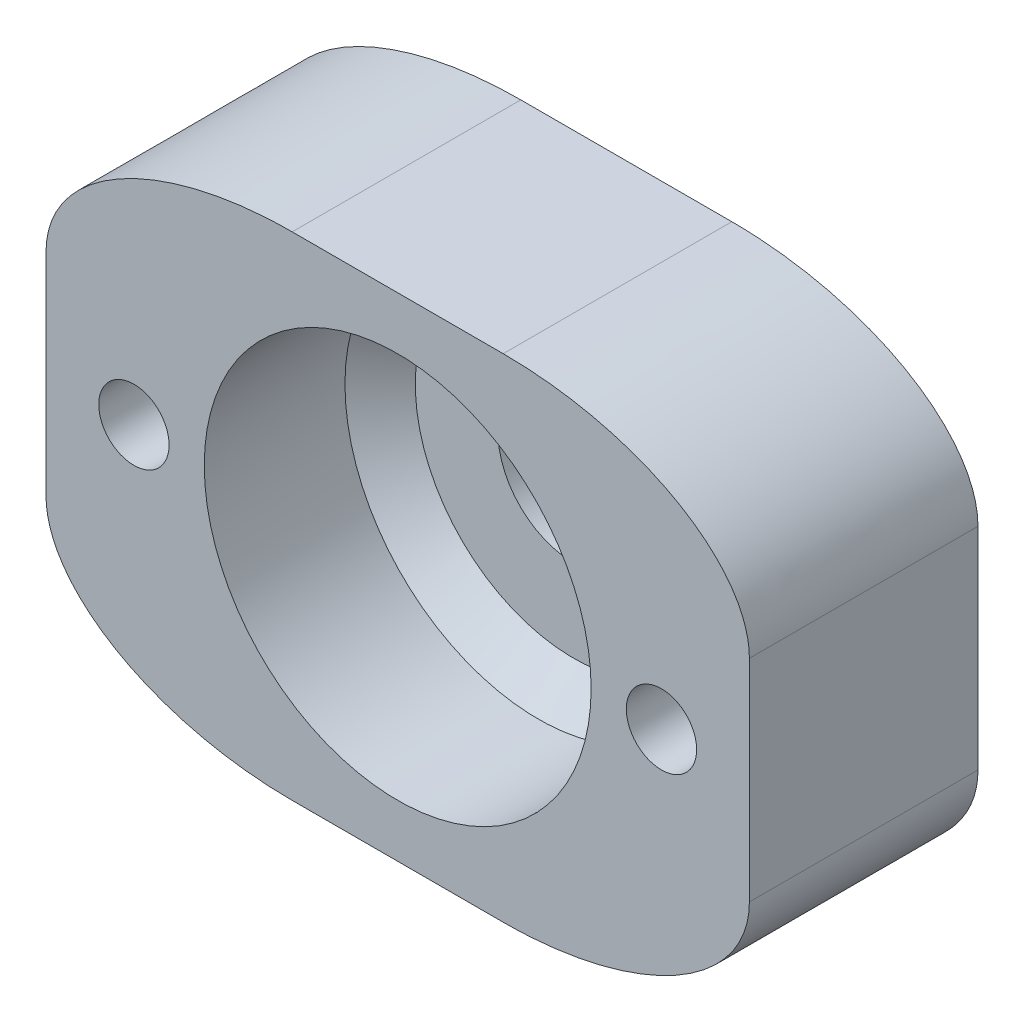
ISO-10303-21;
HEADER;
FILE_DESCRIPTION(('STEP AP214'),'2;1');
FILE_NAME('part.step','',(''),(''),'','','');
FILE_SCHEMA(('AUTOMOTIVE_DESIGN { 1 0 10303 214 1 1 1 1 }'));
ENDSEC;
DATA;
#1=APPLICATION_CONTEXT('core data for automotive mechanical design processes');
#2=APPLICATION_PROTOCOL_DEFINITION('international standard','automotive_design',2000,#1);
#3=PRODUCT_CONTEXT('',#1,'mechanical');
#4=PRODUCT('Part','Part','',(#3));
#5=PRODUCT_RELATED_PRODUCT_CATEGORY('part','',(#4));
#6=PRODUCT_DEFINITION_FORMATION('','',#4);
#7=PRODUCT_DEFINITION_CONTEXT('part definition',#1,'design');
#8=PRODUCT_DEFINITION('design','',#6,#7);
#9=PRODUCT_DEFINITION_SHAPE('','',#8);
#10=(LENGTH_UNIT() NAMED_UNIT(*) SI_UNIT(.MILLI.,.METRE.));
#11=(NAMED_UNIT(*) PLANE_ANGLE_UNIT() SI_UNIT($,.RADIAN.));
#12=(NAMED_UNIT(*) SI_UNIT($,.STERADIAN.) SOLID_ANGLE_UNIT());
#13=UNCERTAINTY_MEASURE_WITH_UNIT(LENGTH_MEASURE(1.E-05),#10,'distance_accuracy_value','');
#14=(GEOMETRIC_REPRESENTATION_CONTEXT(3) GLOBAL_UNCERTAINTY_ASSIGNED_CONTEXT((#13)) GLOBAL_UNIT_ASSIGNED_CONTEXT((#10,
#11,#12)) REPRESENTATION_CONTEXT('',''));
#15=CARTESIAN_POINT('',(0.,0.,0.));
#16=DIRECTION('',(0.,0.,1.));
#17=DIRECTION('',(1.,0.,0.));
#18=AXIS2_PLACEMENT_3D('',#15,#16,#17);
#19=CARTESIAN_POINT('',(0.,0.,10.));
#20=DIRECTION('',(0.,0.,-1.));
#21=DIRECTION('',(-1.,0.,0.));
#22=AXIS2_PLACEMENT_3D('',#19,#20,#21);
#23=PLANE('',#22);
#24=CARTESIAN_POINT('',(-15.,0.,10.));
#25=DIRECTION('',(0.,0.,1.));
#26=DIRECTION('',(1.,0.,0.));
#27=AXIS2_PLACEMENT_3D('',#24,#25,#26);
#28=CIRCLE('',#27,2.);
#29=CARTESIAN_POINT('',(-13.,0.,10.));
#30=VERTEX_POINT('',#29);
#31=EDGE_CURVE('E475',#30,#30,#28,.T.);
#32=ORIENTED_EDGE('',*,*,#31,.F.);
#33=EDGE_LOOP('',(#32));
#34=FACE_BOUND('',#33,.T.);
#35=CARTESIAN_POINT('',(15.,0.,10.));
#36=DIRECTION('',(0.,0.,1.));
#37=DIRECTION('',(1.,0.,0.));
#38=AXIS2_PLACEMENT_3D('',#35,#36,#37);
#39=CIRCLE('',#38,2.);
#40=CARTESIAN_POINT('',(17.,0.,10.));
#41=VERTEX_POINT('',#40);
#42=EDGE_CURVE('E481',#41,#41,#39,.T.);
#43=ORIENTED_EDGE('',*,*,#42,.F.);
#44=EDGE_LOOP('',(#43));
#45=FACE_BOUND('',#44,.T.);
#46=DIRECTION('',(0.,1.,0.));
#47=VECTOR('',#46,1.);
#48=CARTESIAN_POINT('',(20.,-14.,10.));
#49=LINE('',#48,#47);
#50=CARTESIAN_POINT('',(20.,-6.,10.));
#51=VERTEX_POINT('',#50);
#52=CARTESIAN_POINT('',(20.,6.,10.));
#53=VERTEX_POINT('',#52);
#54=EDGE_CURVE('E153',#51,#53,#49,.T.);
#55=ORIENTED_EDGE('',*,*,#54,.T.);
#56=CARTESIAN_POINT('',(6.00000000000001,14.,10.));
#57=CARTESIAN_POINT('',(20.,14.,10.));
#58=CARTESIAN_POINT('',(20.,6.,10.));
#59=(BOUNDED_CURVE() B_SPLINE_CURVE(2,(#56,#57,#58),.UNSPECIFIED.,.F.,
.F.) B_SPLINE_CURVE_WITH_KNOTS((3,3),(0.,1.),
.UNSPECIFIED.) CURVE() GEOMETRIC_REPRESENTATION_ITEM() RATIONAL_B_SPLINE_CURVE((1.,
0.707106781186548,1.)) REPRESENTATION_ITEM(''));
#60=CARTESIAN_POINT('',(6.00000000000001,14.,10.));
#61=VERTEX_POINT('',#60);
#62=EDGE_CURVE('E261',#53,#61,#59,.F.);
#63=ORIENTED_EDGE('',*,*,#62,.T.);
#64=DIRECTION('',(-1.,0.,0.));
#65=VECTOR('',#64,1.);
#66=CARTESIAN_POINT('',(-20.,14.,10.));
#67=LINE('',#66,#65);
#68=CARTESIAN_POINT('',(-5.99999999999999,14.,10.));
#69=VERTEX_POINT('',#68);
#70=EDGE_CURVE('E320',#61,#69,#67,.T.);
#71=ORIENTED_EDGE('',*,*,#70,.T.);
#72=CARTESIAN_POINT('',(-20.,6.,10.));
#73=CARTESIAN_POINT('',(-20.,14.,10.));
#74=CARTESIAN_POINT('',(-5.99999999999999,14.,10.));
#75=(BOUNDED_CURVE() B_SPLINE_CURVE(2,(#72,#73,#74),.UNSPECIFIED.,.F.,
.F.) B_SPLINE_CURVE_WITH_KNOTS((3,3),(0.,1.),
.UNSPECIFIED.) CURVE() GEOMETRIC_REPRESENTATION_ITEM() RATIONAL_B_SPLINE_CURVE((1.,
0.707106781186548,1.)) REPRESENTATION_ITEM(''));
#76=CARTESIAN_POINT('',(-20.,6.,10.));
#77=VERTEX_POINT('',#76);
#78=EDGE_CURVE('E328',#69,#77,#75,.F.);
#79=ORIENTED_EDGE('',*,*,#78,.T.);
#80=DIRECTION('',(0.,-1.,0.));
#81=VECTOR('',#80,1.);
#82=CARTESIAN_POINT('',(-20.,-14.,10.));
#83=LINE('',#82,#81);
#84=CARTESIAN_POINT('',(-20.,-6.,10.));
#85=VERTEX_POINT('',#84);
#86=EDGE_CURVE('E195',#77,#85,#83,.T.);
#87=ORIENTED_EDGE('',*,*,#86,.T.);
#88=CARTESIAN_POINT('',(-5.99999999999999,-14.,10.));
#89=CARTESIAN_POINT('',(-20.,-14.,10.));
#90=CARTESIAN_POINT('',(-20.,-6.,10.));
#91=(BOUNDED_CURVE() B_SPLINE_CURVE(2,(#88,#89,#90),.UNSPECIFIED.,.F.,
.F.) B_SPLINE_CURVE_WITH_KNOTS((3,3),(0.,1.),
.UNSPECIFIED.) CURVE() GEOMETRIC_REPRESENTATION_ITEM() RATIONAL_B_SPLINE_CURVE((1.,
0.707106781186548,1.)) REPRESENTATION_ITEM(''));
#92=CARTESIAN_POINT('',(-5.99999999999999,-14.,10.));
#93=VERTEX_POINT('',#92);
#94=EDGE_CURVE('E74',#85,#93,#91,.F.);
#95=ORIENTED_EDGE('',*,*,#94,.T.);
#96=DIRECTION('',(1.,0.,0.));
#97=VECTOR('',#96,1.);
#98=CARTESIAN_POINT('',(-20.,-14.,10.));
#99=LINE('',#98,#97);
#100=CARTESIAN_POINT('',(6.00000000000001,-14.,10.));
#101=VERTEX_POINT('',#100);
#102=EDGE_CURVE('E187',#93,#101,#99,.T.);
#103=ORIENTED_EDGE('',*,*,#102,.T.);
#104=CARTESIAN_POINT('',(20.,-6.,10.));
#105=CARTESIAN_POINT('',(20.,-14.,10.));
#106=CARTESIAN_POINT('',(6.00000000000001,-14.,10.));
#107=(BOUNDED_CURVE() B_SPLINE_CURVE(2,(#104,#105,#106),.UNSPECIFIED.,.F.,
.F.) B_SPLINE_CURVE_WITH_KNOTS((3,3),(0.,1.),
.UNSPECIFIED.) CURVE() GEOMETRIC_REPRESENTATION_ITEM() RATIONAL_B_SPLINE_CURVE((1.,
0.707106781186548,1.)) REPRESENTATION_ITEM(''));
#108=EDGE_CURVE('E332',#101,#51,#107,.F.);
#109=ORIENTED_EDGE('',*,*,#108,.T.);
#110=EDGE_LOOP('',(#55,#63,#71,#79,#87,#95,#103,#109));
#111=FACE_BOUND('',#110,.T.);
#112=CARTESIAN_POINT('',(0.,0.,10.));
#113=DIRECTION('',(0.,0.,1.));
#114=DIRECTION('',(1.,0.,0.));
#115=AXIS2_PLACEMENT_3D('',#112,#113,#114);
#116=CIRCLE('',#115,11.);
#117=CARTESIAN_POINT('',(11.,0.,10.));
#118=VERTEX_POINT('',#117);
#119=EDGE_CURVE('E423',#118,#118,#116,.T.);
#120=ORIENTED_EDGE('',*,*,#119,.F.);
#121=EDGE_LOOP('',(#120));
#122=FACE_BOUND('',#121,.T.);
#123=ADVANCED_FACE('F47',(#34,#45,#111,#122),#23,.F.);
#124=CARTESIAN_POINT('',(20.,-14.,10.));
#125=DIRECTION('',(-1.,0.,0.));
#126=DIRECTION('',(0.,0.,1.));
#127=AXIS2_PLACEMENT_3D('',#124,#125,#126);
#128=PLANE('',#127);
#129=DIRECTION('',(0.,-1.,0.));
#130=VECTOR('',#129,1.);
#131=CARTESIAN_POINT('',(20.,-14.,-3.));
#132=LINE('',#131,#130);
#133=CARTESIAN_POINT('',(20.,6.,-3.));
#134=VERTEX_POINT('',#133);
#135=CARTESIAN_POINT('',(20.,-6.,-3.));
#136=VERTEX_POINT('',#135);
#137=EDGE_CURVE('E119',#134,#136,#132,.T.);
#138=ORIENTED_EDGE('',*,*,#137,.F.);
#139=CARTESIAN_POINT('',(20.,6.,10.65));
#140=CARTESIAN_POINT('',(20.,6.,5.88333333333334));
#141=CARTESIAN_POINT('',(20.,6.,1.11666666666666));
#142=CARTESIAN_POINT('',(20.,6.,-3.65));
#143=(BOUNDED_CURVE() B_SPLINE_CURVE(3,(#139,#140,#141,#142),.UNSPECIFIED.,.F.,
.F.) B_SPLINE_CURVE_WITH_KNOTS((4,4),(-0.00065,0.01365),
.UNSPECIFIED.) CURVE() GEOMETRIC_REPRESENTATION_ITEM() RATIONAL_B_SPLINE_CURVE((1.,1.,1.,1.)) REPRESENTATION_ITEM(''));
#144=EDGE_CURVE('E702',#134,#53,#143,.F.);
#145=ORIENTED_EDGE('',*,*,#144,.T.);
#146=ORIENTED_EDGE('',*,*,#54,.F.);
#147=CARTESIAN_POINT('',(20.,-6.,-3.65));
#148=CARTESIAN_POINT('',(20.,-6.,1.11666666666666));
#149=CARTESIAN_POINT('',(20.,-6.,5.88333333333334));
#150=CARTESIAN_POINT('',(20.,-6.,10.65));
#151=(BOUNDED_CURVE() B_SPLINE_CURVE(3,(#147,#148,#149,#150),.UNSPECIFIED.,.F.,
.F.) B_SPLINE_CURVE_WITH_KNOTS((4,4),(-0.00065,0.01365),
.UNSPECIFIED.) CURVE() GEOMETRIC_REPRESENTATION_ITEM() RATIONAL_B_SPLINE_CURVE((1.,1.,1.,1.)) REPRESENTATION_ITEM(''));
#152=EDGE_CURVE('E141',#51,#136,#151,.F.);
#153=ORIENTED_EDGE('',*,*,#152,.T.);
#154=EDGE_LOOP('',(#138,#145,#146,#153));
#155=FACE_BOUND('',#154,.T.);
#156=ADVANCED_FACE('F151',(#155),#128,.F.);
#157=CARTESIAN_POINT('',(-20.,14.,10.));
#158=DIRECTION('',(0.,-1.,0.));
#159=DIRECTION('',(0.,0.,-1.));
#160=AXIS2_PLACEMENT_3D('',#157,#158,#159);
#161=PLANE('',#160);
#162=ORIENTED_EDGE('',*,*,#70,.F.);
#163=CARTESIAN_POINT('',(6.00000000000001,14.,-3.65));
#164=CARTESIAN_POINT('',(6.00000000000001,14.,1.11666666666666));
#165=CARTESIAN_POINT('',(6.00000000000001,14.,5.88333333333334));
#166=CARTESIAN_POINT('',(6.00000000000001,14.,10.65));
#167=(BOUNDED_CURVE() B_SPLINE_CURVE(3,(#163,#164,#165,#166),.UNSPECIFIED.,.F.,
.F.) B_SPLINE_CURVE_WITH_KNOTS((4,4),(-0.00065,0.01365),
.UNSPECIFIED.) CURVE() GEOMETRIC_REPRESENTATION_ITEM() RATIONAL_B_SPLINE_CURVE((1.,1.,1.,1.)) REPRESENTATION_ITEM(''));
#168=CARTESIAN_POINT('',(6.00000000000001,14.,-3.));
#169=VERTEX_POINT('',#168);
#170=EDGE_CURVE('E325',#61,#169,#167,.F.);
#171=ORIENTED_EDGE('',*,*,#170,.T.);
#172=DIRECTION('',(1.,0.,0.));
#173=VECTOR('',#172,1.);
#174=CARTESIAN_POINT('',(20.,14.,-3.));
#175=LINE('',#174,#173);
#176=CARTESIAN_POINT('',(-5.99999999999999,14.,-3.));
#177=VERTEX_POINT('',#176);
#178=EDGE_CURVE('E133',#177,#169,#175,.T.);
#179=ORIENTED_EDGE('',*,*,#178,.F.);
#180=CARTESIAN_POINT('',(-5.99999999999999,14.,10.65));
#181=CARTESIAN_POINT('',(-5.99999999999999,14.,5.88333333333334));
#182=CARTESIAN_POINT('',(-5.99999999999999,14.,1.11666666666666));
#183=CARTESIAN_POINT('',(-5.99999999999999,14.,-3.65));
#184=(BOUNDED_CURVE() B_SPLINE_CURVE(3,(#180,#181,#182,#183),.UNSPECIFIED.,.F.,
.F.) B_SPLINE_CURVE_WITH_KNOTS((4,4),(-0.00065,0.01365),
.UNSPECIFIED.) CURVE() GEOMETRIC_REPRESENTATION_ITEM() RATIONAL_B_SPLINE_CURVE((1.,1.,1.,1.)) REPRESENTATION_ITEM(''));
#185=EDGE_CURVE('E310',#177,#69,#184,.F.);
#186=ORIENTED_EDGE('',*,*,#185,.T.);
#187=EDGE_LOOP('',(#162,#171,#179,#186));
#188=FACE_BOUND('',#187,.T.);
#189=ADVANCED_FACE('F174',(#188),#161,.F.);
#190=CARTESIAN_POINT('',(-20.,-14.,10.));
#191=DIRECTION('',(1.,0.,0.));
#192=DIRECTION('',(0.,0.,-1.));
#193=AXIS2_PLACEMENT_3D('',#190,#191,#192);
#194=PLANE('',#193);
#195=DIRECTION('',(0.,1.,0.));
#196=VECTOR('',#195,1.);
#197=CARTESIAN_POINT('',(-20.,14.,-3.));
#198=LINE('',#197,#196);
#199=CARTESIAN_POINT('',(-20.,-6.,-3.));
#200=VERTEX_POINT('',#199);
#201=CARTESIAN_POINT('',(-20.,6.,-3.));
#202=VERTEX_POINT('',#201);
#203=EDGE_CURVE('E466',#200,#202,#198,.T.);
#204=ORIENTED_EDGE('',*,*,#203,.F.);
#205=CARTESIAN_POINT('',(-20.,-6.,10.65));
#206=CARTESIAN_POINT('',(-20.,-6.,5.88333333333334));
#207=CARTESIAN_POINT('',(-20.,-6.,1.11666666666666));
#208=CARTESIAN_POINT('',(-20.,-6.,-3.65));
#209=(BOUNDED_CURVE() B_SPLINE_CURVE(3,(#205,#206,#207,#208),.UNSPECIFIED.,.F.,
.F.) B_SPLINE_CURVE_WITH_KNOTS((4,4),(-0.00065,0.01365),
.UNSPECIFIED.) CURVE() GEOMETRIC_REPRESENTATION_ITEM() RATIONAL_B_SPLINE_CURVE((1.,1.,1.,1.)) REPRESENTATION_ITEM(''));
#210=EDGE_CURVE('E12',#200,#85,#209,.F.);
#211=ORIENTED_EDGE('',*,*,#210,.T.);
#212=ORIENTED_EDGE('',*,*,#86,.F.);
#213=CARTESIAN_POINT('',(-20.,6.,-3.65));
#214=CARTESIAN_POINT('',(-20.,6.,1.11666666666666));
#215=CARTESIAN_POINT('',(-20.,6.,5.88333333333334));
#216=CARTESIAN_POINT('',(-20.,6.,10.65));
#217=(BOUNDED_CURVE() B_SPLINE_CURVE(3,(#213,#214,#215,#216),.UNSPECIFIED.,.F.,
.F.) B_SPLINE_CURVE_WITH_KNOTS((4,4),(-0.00065,0.01365),
.UNSPECIFIED.) CURVE() GEOMETRIC_REPRESENTATION_ITEM() RATIONAL_B_SPLINE_CURVE((1.,1.,1.,1.)) REPRESENTATION_ITEM(''));
#218=EDGE_CURVE('E326',#77,#202,#217,.F.);
#219=ORIENTED_EDGE('',*,*,#218,.T.);
#220=EDGE_LOOP('',(#204,#211,#212,#219));
#221=FACE_BOUND('',#220,.T.);
#222=ADVANCED_FACE('F287',(#221),#194,.F.);
#223=CARTESIAN_POINT('',(-20.,-14.,10.));
#224=DIRECTION('',(0.,1.,0.));
#225=DIRECTION('',(0.,0.,1.));
#226=AXIS2_PLACEMENT_3D('',#223,#224,#225);
#227=PLANE('',#226);
#228=ORIENTED_EDGE('',*,*,#102,.F.);
#229=CARTESIAN_POINT('',(-5.99999999999999,-14.,-3.65));
#230=CARTESIAN_POINT('',(-5.99999999999999,-14.,1.11666666666666));
#231=CARTESIAN_POINT('',(-5.99999999999999,-14.,5.88333333333334));
#232=CARTESIAN_POINT('',(-5.99999999999999,-14.,10.65));
#233=(BOUNDED_CURVE() B_SPLINE_CURVE(3,(#229,#230,#231,#232),.UNSPECIFIED.,.F.,
.F.) B_SPLINE_CURVE_WITH_KNOTS((4,4),(-0.00065,0.01365),
.UNSPECIFIED.) CURVE() GEOMETRIC_REPRESENTATION_ITEM() RATIONAL_B_SPLINE_CURVE((1.,1.,1.,1.)) REPRESENTATION_ITEM(''));
#234=CARTESIAN_POINT('',(-5.99999999999999,-14.,-3.));
#235=VERTEX_POINT('',#234);
#236=EDGE_CURVE('E61',#93,#235,#233,.F.);
#237=ORIENTED_EDGE('',*,*,#236,.T.);
#238=DIRECTION('',(-1.,0.,0.));
#239=VECTOR('',#238,1.);
#240=CARTESIAN_POINT('',(-20.,-14.,-3.));
#241=LINE('',#240,#239);
#242=CARTESIAN_POINT('',(6.00000000000001,-14.,-3.));
#243=VERTEX_POINT('',#242);
#244=EDGE_CURVE('E132',#243,#235,#241,.T.);
#245=ORIENTED_EDGE('',*,*,#244,.F.);
#246=CARTESIAN_POINT('',(6.00000000000001,-14.,10.65));
#247=CARTESIAN_POINT('',(6.00000000000001,-14.,5.88333333333334));
#248=CARTESIAN_POINT('',(6.00000000000001,-14.,1.11666666666666));
#249=CARTESIAN_POINT('',(6.00000000000001,-14.,-3.65));
#250=(BOUNDED_CURVE() B_SPLINE_CURVE(3,(#246,#247,#248,#249),.UNSPECIFIED.,.F.,
.F.) B_SPLINE_CURVE_WITH_KNOTS((4,4),(-0.00065,0.01365),
.UNSPECIFIED.) CURVE() GEOMETRIC_REPRESENTATION_ITEM() RATIONAL_B_SPLINE_CURVE((1.,1.,1.,1.)) REPRESENTATION_ITEM(''));
#251=EDGE_CURVE('E144',#243,#101,#250,.F.);
#252=ORIENTED_EDGE('',*,*,#251,.T.);
#253=EDGE_LOOP('',(#228,#237,#245,#252));
#254=FACE_BOUND('',#253,.T.);
#255=ADVANCED_FACE('F225',(#254),#227,.F.);
#256=CARTESIAN_POINT('',(0.,0.,10.));
#257=DIRECTION('',(0.,0.,-1.));
#258=DIRECTION('',(-1.,0.,0.));
#259=AXIS2_PLACEMENT_3D('',#256,#257,#258);
#260=CYLINDRICAL_SURFACE('',#259,11.);
#261=CARTESIAN_POINT('',(0.,0.,1.99999999999999));
#262=DIRECTION('',(0.,0.,1.));
#263=DIRECTION('',(1.,0.,0.));
#264=AXIS2_PLACEMENT_3D('',#261,#262,#263);
#265=CIRCLE('',#264,11.);
#266=CARTESIAN_POINT('',(11.,0.,1.99999999999999));
#267=VERTEX_POINT('',#266);
#268=EDGE_CURVE('E154',#267,#267,#265,.F.);
#269=ORIENTED_EDGE('',*,*,#268,.T.);
#270=EDGE_LOOP('',(#269));
#271=FACE_BOUND('',#270,.T.);
#272=ORIENTED_EDGE('',*,*,#119,.T.);
#273=EDGE_LOOP('',(#272));
#274=FACE_BOUND('',#273,.T.);
#275=ADVANCED_FACE('F206',(#271,#274),#260,.F.);
#276=CARTESIAN_POINT('',(0.,0.,0.));
#277=DIRECTION('',(0.,0.,1.));
#278=DIRECTION('',(1.,0.,0.));
#279=AXIS2_PLACEMENT_3D('',#276,#277,#278);
#280=PLANE('',#279);
#281=CARTESIAN_POINT('',(0.,0.,0.));
#282=DIRECTION('',(0.,0.,1.));
#283=DIRECTION('',(1.,0.,0.));
#284=AXIS2_PLACEMENT_3D('',#281,#282,#283);
#285=CIRCLE('',#284,4.3);
#286=CARTESIAN_POINT('',(4.3,0.,0.));
#287=VERTEX_POINT('',#286);
#288=EDGE_CURVE('E471',#287,#287,#285,.T.);
#289=ORIENTED_EDGE('',*,*,#288,.F.);
#290=EDGE_LOOP('',(#289));
#291=FACE_BOUND('',#290,.T.);
#292=CARTESIAN_POINT('',(0.,0.,0.));
#293=DIRECTION('',(0.,0.,1.));
#294=DIRECTION('',(1.,0.,0.));
#295=AXIS2_PLACEMENT_3D('',#292,#293,#294);
#296=CIRCLE('',#295,8.99999999999999);
#297=CARTESIAN_POINT('',(8.99999999999999,0.,0.));
#298=VERTEX_POINT('',#297);
#299=EDGE_CURVE('E194',#298,#298,#296,.T.);
#300=ORIENTED_EDGE('',*,*,#299,.T.);
#301=EDGE_LOOP('',(#300));
#302=FACE_BOUND('',#301,.T.);
#303=ADVANCED_FACE('F214',(#291,#302),#280,.T.);
#304=CARTESIAN_POINT('',(0.,0.,-3.));
#305=DIRECTION('',(0.,0.,1.));
#306=DIRECTION('',(1.,0.,0.));
#307=AXIS2_PLACEMENT_3D('',#304,#305,#306);
#308=PLANE('',#307);
#309=CARTESIAN_POINT('',(15.,0.,-3.));
#310=DIRECTION('',(0.,0.,-1.));
#311=DIRECTION('',(-1.,0.,0.));
#312=AXIS2_PLACEMENT_3D('',#309,#310,#311);
#313=CIRCLE('',#312,2.6);
#314=CARTESIAN_POINT('',(12.4,0.,-3.));
#315=VERTEX_POINT('',#314);
#316=EDGE_CURVE('E496',#315,#315,#313,.T.);
#317=ORIENTED_EDGE('',*,*,#316,.F.);
#318=EDGE_LOOP('',(#317));
#319=FACE_BOUND('',#318,.T.);
#320=CARTESIAN_POINT('',(-15.,0.,-3.));
#321=DIRECTION('',(0.,0.,-1.));
#322=DIRECTION('',(-1.,0.,0.));
#323=AXIS2_PLACEMENT_3D('',#320,#321,#322);
#324=CIRCLE('',#323,2.6);
#325=CARTESIAN_POINT('',(-17.6,0.,-3.));
#326=VERTEX_POINT('',#325);
#327=EDGE_CURVE('E493',#326,#326,#324,.T.);
#328=ORIENTED_EDGE('',*,*,#327,.F.);
#329=EDGE_LOOP('',(#328));
#330=FACE_BOUND('',#329,.T.);
#331=CARTESIAN_POINT('',(0.,0.,-3.));
#332=DIRECTION('',(0.,0.,1.));
#333=DIRECTION('',(1.,0.,0.));
#334=AXIS2_PLACEMENT_3D('',#331,#332,#333);
#335=CIRCLE('',#334,4.3);
#336=CARTESIAN_POINT('',(4.3,0.,-3.));
#337=VERTEX_POINT('',#336);
#338=EDGE_CURVE('E468',#337,#337,#335,.T.);
#339=ORIENTED_EDGE('',*,*,#338,.T.);
#340=EDGE_LOOP('',(#339));
#341=FACE_BOUND('',#340,.T.);
#342=ORIENTED_EDGE('',*,*,#178,.T.);
#343=CARTESIAN_POINT('',(20.,6.,-3.));
#344=CARTESIAN_POINT('',(20.,14.,-3.));
#345=CARTESIAN_POINT('',(6.00000000000001,14.,-3.));
#346=(BOUNDED_CURVE() B_SPLINE_CURVE(2,(#343,#344,#345),.UNSPECIFIED.,.F.,
.F.) B_SPLINE_CURVE_WITH_KNOTS((3,3),(0.,1.),
.UNSPECIFIED.) CURVE() GEOMETRIC_REPRESENTATION_ITEM() RATIONAL_B_SPLINE_CURVE((1.,
0.707106781186548,1.)) REPRESENTATION_ITEM(''));
#347=EDGE_CURVE('E127',#169,#134,#346,.F.);
#348=ORIENTED_EDGE('',*,*,#347,.T.);
#349=ORIENTED_EDGE('',*,*,#137,.T.);
#350=CARTESIAN_POINT('',(6.00000000000001,-14.,-3.));
#351=CARTESIAN_POINT('',(20.,-14.,-3.));
#352=CARTESIAN_POINT('',(20.,-6.,-3.));
#353=(BOUNDED_CURVE() B_SPLINE_CURVE(2,(#350,#351,#352),.UNSPECIFIED.,.F.,
.F.) B_SPLINE_CURVE_WITH_KNOTS((3,3),(0.,1.),
.UNSPECIFIED.) CURVE() GEOMETRIC_REPRESENTATION_ITEM() RATIONAL_B_SPLINE_CURVE((1.,
0.707106781186548,1.)) REPRESENTATION_ITEM(''));
#354=EDGE_CURVE('E124',#136,#243,#353,.F.);
#355=ORIENTED_EDGE('',*,*,#354,.T.);
#356=ORIENTED_EDGE('',*,*,#244,.T.);
#357=CARTESIAN_POINT('',(-20.,-6.,-3.));
#358=CARTESIAN_POINT('',(-20.,-14.,-3.));
#359=CARTESIAN_POINT('',(-5.99999999999999,-14.,-3.));
#360=(BOUNDED_CURVE() B_SPLINE_CURVE(2,(#357,#358,#359),.UNSPECIFIED.,.F.,
.F.) B_SPLINE_CURVE_WITH_KNOTS((3,3),(0.,1.),
.UNSPECIFIED.) CURVE() GEOMETRIC_REPRESENTATION_ITEM() RATIONAL_B_SPLINE_CURVE((1.,
0.707106781186548,1.)) REPRESENTATION_ITEM(''));
#361=EDGE_CURVE('E465',#235,#200,#360,.F.);
#362=ORIENTED_EDGE('',*,*,#361,.T.);
#363=ORIENTED_EDGE('',*,*,#203,.T.);
#364=CARTESIAN_POINT('',(-5.99999999999999,14.,-3.));
#365=CARTESIAN_POINT('',(-20.,14.,-3.));
#366=CARTESIAN_POINT('',(-20.,6.,-3.));
#367=(BOUNDED_CURVE() B_SPLINE_CURVE(2,(#364,#365,#366),.UNSPECIFIED.,.F.,
.F.) B_SPLINE_CURVE_WITH_KNOTS((3,3),(0.,1.),
.UNSPECIFIED.) CURVE() GEOMETRIC_REPRESENTATION_ITEM() RATIONAL_B_SPLINE_CURVE((1.,
0.707106781186548,1.)) REPRESENTATION_ITEM(''));
#368=EDGE_CURVE('E146',#202,#177,#367,.F.);
#369=ORIENTED_EDGE('',*,*,#368,.T.);
#370=EDGE_LOOP('',(#342,#348,#349,#355,#356,#362,#363,#369));
#371=FACE_BOUND('',#370,.T.);
#372=ADVANCED_FACE('F122',(#319,#330,#341,#371),#308,.F.);
#373=CARTESIAN_POINT('',(0.,0.,0.));
#374=DIRECTION('',(0.,0.,1.));
#375=DIRECTION('',(1.,0.,0.));
#376=AXIS2_PLACEMENT_3D('',#373,#374,#375);
#377=CONICAL_SURFACE('',#376,8.99999999999999,0.785398163397453);
#378=ORIENTED_EDGE('',*,*,#268,.F.);
#379=EDGE_LOOP('',(#378));
#380=FACE_BOUND('',#379,.T.);
#381=ORIENTED_EDGE('',*,*,#299,.F.);
#382=EDGE_LOOP('',(#381));
#383=FACE_BOUND('',#382,.T.);
#384=ADVANCED_FACE('F178',(#380,#383),#377,.F.);
#385=CARTESIAN_POINT('',(0.,0.,-3.));
#386=DIRECTION('',(0.,0.,1.));
#387=DIRECTION('',(1.,0.,0.));
#388=AXIS2_PLACEMENT_3D('',#385,#386,#387);
#389=CYLINDRICAL_SURFACE('',#388,4.3);
#390=ORIENTED_EDGE('',*,*,#338,.F.);
#391=EDGE_LOOP('',(#390));
#392=FACE_BOUND('',#391,.T.);
#393=ORIENTED_EDGE('',*,*,#288,.T.);
#394=EDGE_LOOP('',(#393));
#395=FACE_BOUND('',#394,.T.);
#396=ADVANCED_FACE('F211',(#392,#395),#389,.F.);
#397=CARTESIAN_POINT('',(15.,0.,4.));
#398=DIRECTION('',(0.,0.,1.));
#399=DIRECTION('',(1.,0.,0.));
#400=AXIS2_PLACEMENT_3D('',#397,#398,#399);
#401=CYLINDRICAL_SURFACE('',#400,2.);
#402=CARTESIAN_POINT('',(15.,0.,4.));
#403=DIRECTION('',(0.,0.,1.));
#404=DIRECTION('',(1.,0.,0.));
#405=AXIS2_PLACEMENT_3D('',#402,#403,#404);
#406=CIRCLE('',#405,2.);
#407=CARTESIAN_POINT('',(17.,0.,4.));
#408=VERTEX_POINT('',#407);
#409=EDGE_CURVE('E478',#408,#408,#406,.T.);
#410=ORIENTED_EDGE('',*,*,#409,.F.);
#411=EDGE_LOOP('',(#410));
#412=FACE_BOUND('',#411,.T.);
#413=ORIENTED_EDGE('',*,*,#42,.T.);
#414=EDGE_LOOP('',(#413));
#415=FACE_BOUND('',#414,.T.);
#416=ADVANCED_FACE('F516',(#412,#415),#401,.F.);
#417=CARTESIAN_POINT('',(-15.,0.,4.));
#418=DIRECTION('',(0.,0.,1.));
#419=DIRECTION('',(1.,0.,0.));
#420=AXIS2_PLACEMENT_3D('',#417,#418,#419);
#421=CYLINDRICAL_SURFACE('',#420,2.);
#422=CARTESIAN_POINT('',(-15.,0.,4.));
#423=DIRECTION('',(0.,0.,1.));
#424=DIRECTION('',(1.,0.,0.));
#425=AXIS2_PLACEMENT_3D('',#422,#423,#424);
#426=CIRCLE('',#425,2.);
#427=CARTESIAN_POINT('',(-13.,0.,4.));
#428=VERTEX_POINT('',#427);
#429=EDGE_CURVE('E482',#428,#428,#426,.T.);
#430=ORIENTED_EDGE('',*,*,#429,.F.);
#431=EDGE_LOOP('',(#430));
#432=FACE_BOUND('',#431,.T.);
#433=ORIENTED_EDGE('',*,*,#31,.T.);
#434=EDGE_LOOP('',(#433));
#435=FACE_BOUND('',#434,.T.);
#436=ADVANCED_FACE('F520',(#432,#435),#421,.F.);
#437=CARTESIAN_POINT('',(20.,-6.,10.65));
#438=CARTESIAN_POINT('',(20.,-6.,5.88333333333334));
#439=CARTESIAN_POINT('',(20.,-6.,1.11666666666666));
#440=CARTESIAN_POINT('',(20.,-6.,-3.65));
#441=CARTESIAN_POINT('',(20.,-14.,10.65));
#442=CARTESIAN_POINT('',(20.,-14.,5.88333333333334));
#443=CARTESIAN_POINT('',(20.,-14.,1.11666666666666));
#444=CARTESIAN_POINT('',(20.,-14.,-3.65));
#445=CARTESIAN_POINT('',(6.00000000000001,-14.,10.65));
#446=CARTESIAN_POINT('',(6.00000000000001,-14.,5.88333333333334));
#447=CARTESIAN_POINT('',(6.00000000000001,-14.,1.11666666666666));
#448=CARTESIAN_POINT('',(6.00000000000001,-14.,-3.65));
#449=(BOUNDED_SURFACE() B_SPLINE_SURFACE(2,3,((#437,#438,#439,#440),(#441,#442,#443,#444),(#445,
#446,#447,#448)),.UNSPECIFIED.,.F.,.F.,.F.) B_SPLINE_SURFACE_WITH_KNOTS((3,3),(4,4),(0.,1.),
(-0.00065,0.01365),
.UNSPECIFIED.) GEOMETRIC_REPRESENTATION_ITEM() RATIONAL_B_SPLINE_SURFACE(((1.,1.,1.,1.),
(0.707106781186548,0.707106781186548,0.707106781186548,0.707106781186548),(1.,1.,1.,1.))) REPRESENTATION_ITEM('') SURFACE());
#450=ORIENTED_EDGE('',*,*,#108,.F.);
#451=ORIENTED_EDGE('',*,*,#251,.F.);
#452=ORIENTED_EDGE('',*,*,#354,.F.);
#453=ORIENTED_EDGE('',*,*,#152,.F.);
#454=EDGE_LOOP('',(#450,#451,#452,#453));
#455=FACE_BOUND('',#454,.T.);
#456=ADVANCED_FACE('F140',(#455),#449,.T.);
#457=CARTESIAN_POINT('',(-20.,6.,10.65));
#458=CARTESIAN_POINT('',(-20.,6.,5.88333333333334));
#459=CARTESIAN_POINT('',(-20.,6.,1.11666666666666));
#460=CARTESIAN_POINT('',(-20.,6.,-3.65));
#461=CARTESIAN_POINT('',(-20.,14.,10.65));
#462=CARTESIAN_POINT('',(-20.,14.,5.88333333333334));
#463=CARTESIAN_POINT('',(-20.,14.,1.11666666666666));
#464=CARTESIAN_POINT('',(-20.,14.,-3.65));
#465=CARTESIAN_POINT('',(-5.99999999999999,14.,10.65));
#466=CARTESIAN_POINT('',(-5.99999999999999,14.,5.88333333333334));
#467=CARTESIAN_POINT('',(-5.99999999999999,14.,1.11666666666666));
#468=CARTESIAN_POINT('',(-5.99999999999999,14.,-3.65));
#469=(BOUNDED_SURFACE() B_SPLINE_SURFACE(2,3,((#457,#458,#459,#460),(#461,#462,#463,#464),(#465,
#466,#467,#468)),.UNSPECIFIED.,.F.,.F.,.F.) B_SPLINE_SURFACE_WITH_KNOTS((3,3),(4,4),(0.,1.),
(-0.00065,0.01365),
.UNSPECIFIED.) GEOMETRIC_REPRESENTATION_ITEM() RATIONAL_B_SPLINE_SURFACE(((1.,1.,1.,1.),
(0.707106781186548,0.707106781186548,0.707106781186548,0.707106781186548),(1.,1.,1.,1.))) REPRESENTATION_ITEM('') SURFACE());
#470=ORIENTED_EDGE('',*,*,#78,.F.);
#471=ORIENTED_EDGE('',*,*,#185,.F.);
#472=ORIENTED_EDGE('',*,*,#368,.F.);
#473=ORIENTED_EDGE('',*,*,#218,.F.);
#474=EDGE_LOOP('',(#470,#471,#472,#473));
#475=FACE_BOUND('',#474,.T.);
#476=ADVANCED_FACE('F330',(#475),#469,.T.);
#477=CARTESIAN_POINT('',(6.00000000000001,14.,10.65));
#478=CARTESIAN_POINT('',(6.00000000000001,14.,5.88333333333334));
#479=CARTESIAN_POINT('',(6.00000000000001,14.,1.11666666666666));
#480=CARTESIAN_POINT('',(6.00000000000001,14.,-3.65));
#481=CARTESIAN_POINT('',(20.,14.,10.65));
#482=CARTESIAN_POINT('',(20.,14.,5.88333333333334));
#483=CARTESIAN_POINT('',(20.,14.,1.11666666666666));
#484=CARTESIAN_POINT('',(20.,14.,-3.65));
#485=CARTESIAN_POINT('',(20.,6.,10.65));
#486=CARTESIAN_POINT('',(20.,6.,5.88333333333334));
#487=CARTESIAN_POINT('',(20.,6.,1.11666666666666));
#488=CARTESIAN_POINT('',(20.,6.,-3.65));
#489=(BOUNDED_SURFACE() B_SPLINE_SURFACE(2,3,((#477,#478,#479,#480),(#481,#482,#483,#484),(#485,
#486,#487,#488)),.UNSPECIFIED.,.F.,.F.,.F.) B_SPLINE_SURFACE_WITH_KNOTS((3,3),(4,4),(0.,1.),
(-0.00065,0.01365),
.UNSPECIFIED.) GEOMETRIC_REPRESENTATION_ITEM() RATIONAL_B_SPLINE_SURFACE(((1.,1.,1.,1.),
(0.707106781186548,0.707106781186548,0.707106781186548,0.707106781186548),(1.,1.,1.,1.))) REPRESENTATION_ITEM('') SURFACE());
#490=ORIENTED_EDGE('',*,*,#62,.F.);
#491=ORIENTED_EDGE('',*,*,#144,.F.);
#492=ORIENTED_EDGE('',*,*,#347,.F.);
#493=ORIENTED_EDGE('',*,*,#170,.F.);
#494=EDGE_LOOP('',(#490,#491,#492,#493));
#495=FACE_BOUND('',#494,.T.);
#496=ADVANCED_FACE('F354',(#495),#489,.T.);
#497=CARTESIAN_POINT('',(-5.99999999999999,-14.,10.65));
#498=CARTESIAN_POINT('',(-5.99999999999999,-14.,5.88333333333334));
#499=CARTESIAN_POINT('',(-5.99999999999999,-14.,1.11666666666666));
#500=CARTESIAN_POINT('',(-5.99999999999999,-14.,-3.65));
#501=CARTESIAN_POINT('',(-20.,-14.,10.65));
#502=CARTESIAN_POINT('',(-20.,-14.,5.88333333333334));
#503=CARTESIAN_POINT('',(-20.,-14.,1.11666666666666));
#504=CARTESIAN_POINT('',(-20.,-14.,-3.65));
#505=CARTESIAN_POINT('',(-20.,-6.,10.65));
#506=CARTESIAN_POINT('',(-20.,-6.,5.88333333333334));
#507=CARTESIAN_POINT('',(-20.,-6.,1.11666666666666));
#508=CARTESIAN_POINT('',(-20.,-6.,-3.65));
#509=(BOUNDED_SURFACE() B_SPLINE_SURFACE(2,3,((#497,#498,#499,#500),(#501,#502,#503,#504),(#505,
#506,#507,#508)),.UNSPECIFIED.,.F.,.F.,.F.) B_SPLINE_SURFACE_WITH_KNOTS((3,3),(4,4),(0.,1.),
(-0.00065,0.01365),
.UNSPECIFIED.) GEOMETRIC_REPRESENTATION_ITEM() RATIONAL_B_SPLINE_SURFACE(((1.,1.,1.,1.),
(0.707106781186548,0.707106781186548,0.707106781186548,0.707106781186548),(1.,1.,1.,1.))) REPRESENTATION_ITEM('') SURFACE());
#510=ORIENTED_EDGE('',*,*,#94,.F.);
#511=ORIENTED_EDGE('',*,*,#210,.F.);
#512=ORIENTED_EDGE('',*,*,#361,.F.);
#513=ORIENTED_EDGE('',*,*,#236,.F.);
#514=EDGE_LOOP('',(#510,#511,#512,#513));
#515=FACE_BOUND('',#514,.T.);
#516=ADVANCED_FACE('F50',(#515),#509,.T.);
#517=CARTESIAN_POINT('',(-15.,0.,4.));
#518=DIRECTION('',(0.,0.,-1.));
#519=DIRECTION('',(-1.,0.,0.));
#520=AXIS2_PLACEMENT_3D('',#517,#518,#519);
#521=PLANE('',#520);
#522=CARTESIAN_POINT('',(-15.,0.,4.));
#523=DIRECTION('',(0.,0.,-1.));
#524=DIRECTION('',(-1.,0.,0.));
#525=AXIS2_PLACEMENT_3D('',#522,#523,#524);
#526=CIRCLE('',#525,2.6);
#527=CARTESIAN_POINT('',(-17.6,0.,4.));
#528=VERTEX_POINT('',#527);
#529=EDGE_CURVE('E490',#528,#528,#526,.T.);
#530=ORIENTED_EDGE('',*,*,#529,.T.);
#531=EDGE_LOOP('',(#530));
#532=FACE_BOUND('',#531,.T.);
#533=ORIENTED_EDGE('',*,*,#429,.T.);
#534=EDGE_LOOP('',(#533));
#535=FACE_BOUND('',#534,.T.);
#536=ADVANCED_FACE('F530',(#532,#535),#521,.T.);
#537=CARTESIAN_POINT('',(-15.,0.,4.));
#538=DIRECTION('',(0.,0.,-1.));
#539=DIRECTION('',(-1.,0.,0.));
#540=AXIS2_PLACEMENT_3D('',#537,#538,#539);
#541=CYLINDRICAL_SURFACE('',#540,2.6);
#542=ORIENTED_EDGE('',*,*,#529,.F.);
#543=EDGE_LOOP('',(#542));
#544=FACE_BOUND('',#543,.T.);
#545=ORIENTED_EDGE('',*,*,#327,.T.);
#546=EDGE_LOOP('',(#545));
#547=FACE_BOUND('',#546,.T.);
#548=ADVANCED_FACE('F533',(#544,#547),#541,.F.);
#549=CARTESIAN_POINT('',(15.,0.,4.));
#550=DIRECTION('',(0.,0.,-1.));
#551=DIRECTION('',(-1.,0.,0.));
#552=AXIS2_PLACEMENT_3D('',#549,#550,#551);
#553=PLANE('',#552);
#554=CARTESIAN_POINT('',(15.,0.,4.));
#555=DIRECTION('',(0.,0.,-1.));
#556=DIRECTION('',(-1.,0.,0.));
#557=AXIS2_PLACEMENT_3D('',#554,#555,#556);
#558=CIRCLE('',#557,2.6);
#559=CARTESIAN_POINT('',(12.4,0.,4.));
#560=VERTEX_POINT('',#559);
#561=EDGE_CURVE('E489',#560,#560,#558,.T.);
#562=ORIENTED_EDGE('',*,*,#561,.T.);
#563=EDGE_LOOP('',(#562));
#564=FACE_BOUND('',#563,.T.);
#565=ORIENTED_EDGE('',*,*,#409,.T.);
#566=EDGE_LOOP('',(#565));
#567=FACE_BOUND('',#566,.T.);
#568=ADVANCED_FACE('F502',(#564,#567),#553,.T.);
#569=CARTESIAN_POINT('',(15.,0.,4.));
#570=DIRECTION('',(0.,0.,-1.));
#571=DIRECTION('',(-1.,0.,0.));
#572=AXIS2_PLACEMENT_3D('',#569,#570,#571);
#573=CYLINDRICAL_SURFACE('',#572,2.6);
#574=ORIENTED_EDGE('',*,*,#561,.F.);
#575=EDGE_LOOP('',(#574));
#576=FACE_BOUND('',#575,.T.);
#577=ORIENTED_EDGE('',*,*,#316,.T.);
#578=EDGE_LOOP('',(#577));
#579=FACE_BOUND('',#578,.T.);
#580=ADVANCED_FACE('F505',(#576,#579),#573,.F.);
#581=CLOSED_SHELL('',(#123,#156,#189,#222,#255,#275,#303,#372,#384,#396,#416,#436,#456,#476,
#496,#516,#536,#548,#568,#580));
#582=MANIFOLD_SOLID_BREP('B2',#581);
#583=ADVANCED_BREP_SHAPE_REPRESENTATION('',(#18,#582),#14);
#584=SHAPE_DEFINITION_REPRESENTATION(#9,#583);
ENDSEC;
END-ISO-10303-21;
